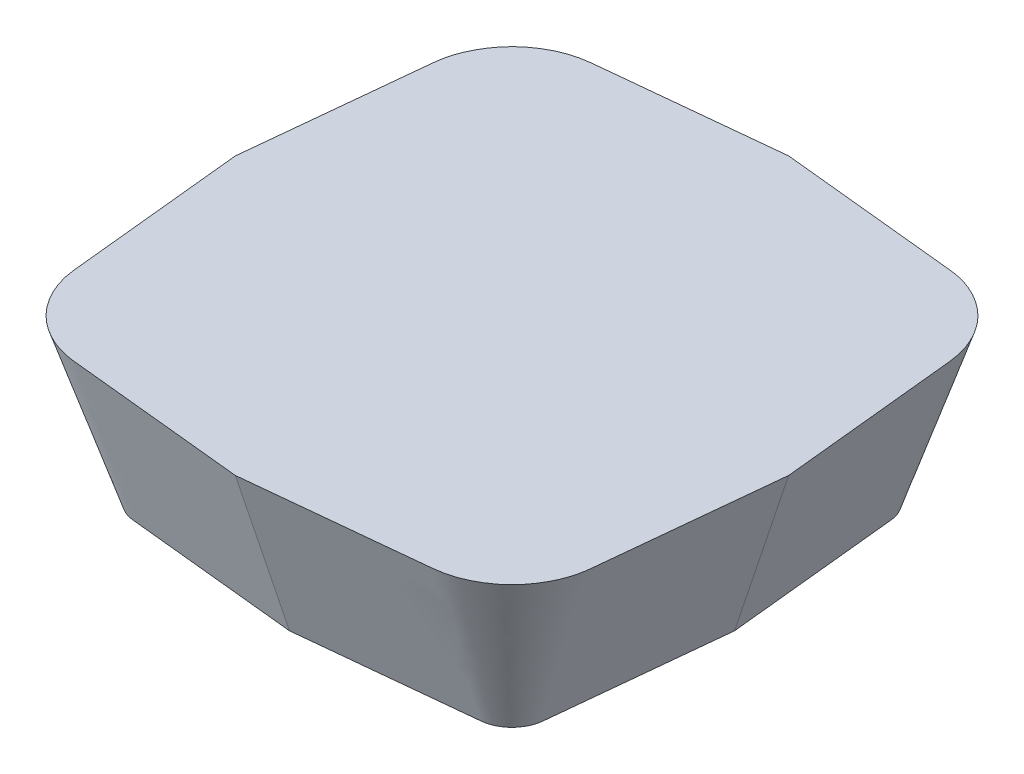
ISO-10303-21;
HEADER;
FILE_DESCRIPTION(('STEP AP214'),'2;1');
FILE_NAME('part.step','',(''),(''),'','','');
FILE_SCHEMA(('AUTOMOTIVE_DESIGN { 1 0 10303 214 1 1 1 1 }'));
ENDSEC;
DATA;
#1=APPLICATION_CONTEXT('core data for automotive mechanical design processes');
#2=APPLICATION_PROTOCOL_DEFINITION('international standard','automotive_design',2000,#1);
#3=PRODUCT_CONTEXT('',#1,'mechanical');
#4=PRODUCT('Part','Part','',(#3));
#5=PRODUCT_RELATED_PRODUCT_CATEGORY('part','',(#4));
#6=PRODUCT_DEFINITION_FORMATION('','',#4);
#7=PRODUCT_DEFINITION_CONTEXT('part definition',#1,'design');
#8=PRODUCT_DEFINITION('design','',#6,#7);
#9=PRODUCT_DEFINITION_SHAPE('','',#8);
#10=(LENGTH_UNIT() NAMED_UNIT(*) SI_UNIT(.MILLI.,.METRE.));
#11=(NAMED_UNIT(*) PLANE_ANGLE_UNIT() SI_UNIT($,.RADIAN.));
#12=(NAMED_UNIT(*) SI_UNIT($,.STERADIAN.) SOLID_ANGLE_UNIT());
#13=UNCERTAINTY_MEASURE_WITH_UNIT(LENGTH_MEASURE(1.E-05),#10,'distance_accuracy_value','');
#14=(GEOMETRIC_REPRESENTATION_CONTEXT(3) GLOBAL_UNCERTAINTY_ASSIGNED_CONTEXT((#13)) GLOBAL_UNIT_ASSIGNED_CONTEXT((#10,
#11,#12)) REPRESENTATION_CONTEXT('',''));
#15=CARTESIAN_POINT('',(0.,0.,0.));
#16=DIRECTION('',(0.,0.,1.));
#17=DIRECTION('',(1.,0.,0.));
#18=AXIS2_PLACEMENT_3D('',#15,#16,#17);
#19=CARTESIAN_POINT('',(-0.487303113514414,0.463919132742288,-0.487303113514415));
#20=DIRECTION('',(0.,1.,0.));
#21=DIRECTION('',(0.,0.,1.));
#22=AXIS2_PLACEMENT_3D('',#19,#20,#21);
#23=PLANE('',#22);
#24=CARTESIAN_POINT('',(0.739729912648628,0.463919132742288,-0.512936816014374));
#25=CARTESIAN_POINT('',(0.737452857510826,0.463919132742045,-0.535360019997695));
#26=CARTESIAN_POINT('',(0.726917252771635,0.463919132742045,-0.585643657845528));
#27=CARTESIAN_POINT('',(0.672247807856146,0.463919132742046,-0.671818827394402));
#28=CARTESIAN_POINT('',(0.585381563870512,0.463919132742045,-0.727219866965819));
#29=CARTESIAN_POINT('',(0.535360019997696,0.463919132742045,-0.737452857510825));
#30=CARTESIAN_POINT('',(0.512936816008313,0.463919132742288,-0.739729912649242));
#31=B_SPLINE_CURVE_WITH_KNOTS('',3,(#24,#25,#26,#27,#28,#29,#30),.UNSPECIFIED.,.F.,.F.,(4,1,1,1,
4),(0.,8.63475877317307E-05,0.000172695175618102,0.000259042763504472,0.000345390351242716),.UNSPECIFIED.);
#32=CARTESIAN_POINT('',(0.739729912648628,0.463919132742288,-0.512936816014374));
#33=VERTEX_POINT('',#32);
#34=CARTESIAN_POINT('',(0.512936816008313,0.463919132742288,-0.739729912649242));
#35=VERTEX_POINT('',#34);
#36=EDGE_CURVE('E11',#33,#35,#31,.T.);
#37=ORIENTED_EDGE('',*,*,#36,.T.);
#38=DIRECTION('',(-0.994883433381918,0.,-0.101029470859782));
#39=VECTOR('',#38,1.);
#40=CARTESIAN_POINT('',(0.512936816008313,0.463919132742288,-0.739729912649242));
#41=LINE('',#40,#39);
#42=CARTESIAN_POINT('',(0.,0.463919132742288,-0.791818160746472));
#43=VERTEX_POINT('',#42);
#44=EDGE_CURVE('E26',#35,#43,#41,.T.);
#45=ORIENTED_EDGE('',*,*,#44,.T.);
#46=DIRECTION('',(-0.994883433381918,0.,0.101029470859782));
#47=VECTOR('',#46,1.);
#48=CARTESIAN_POINT('',(0.,0.463919132742288,-0.791818160746472));
#49=LINE('',#48,#47);
#50=CARTESIAN_POINT('',(-0.512936816014374,0.463919132742288,-0.739729912648627));
#51=VERTEX_POINT('',#50);
#52=EDGE_CURVE('E291',#43,#51,#49,.T.);
#53=ORIENTED_EDGE('',*,*,#52,.T.);
#54=CARTESIAN_POINT('',(-0.512936816014374,0.463919132742288,-0.739729912648627));
#55=CARTESIAN_POINT('',(-0.535360019997694,0.463919132742045,-0.737452857510824));
#56=CARTESIAN_POINT('',(-0.585643657845528,0.463919132742045,-0.726917252771634));
#57=CARTESIAN_POINT('',(-0.671818827394401,0.463919132742044,-0.672247807856145));
#58=CARTESIAN_POINT('',(-0.727219866965817,0.463919132742045,-0.585381563870511));
#59=CARTESIAN_POINT('',(-0.737452857510823,0.463919132742045,-0.535360019997695));
#60=CARTESIAN_POINT('',(-0.739729912649243,0.463919132742288,-0.512936816008295));
#61=B_SPLINE_CURVE_WITH_KNOTS('',3,(#54,#55,#56,#57,#58,#59,#60),.UNSPECIFIED.,.F.,.F.,(4,1,1,1,
4),(0.,8.63475877317296E-05,0.0001726951756181,0.000259042763504469,0.000345390351242732),.UNSPECIFIED.);
#62=CARTESIAN_POINT('',(-0.739729912649243,0.463919132742288,-0.512936816008295));
#63=VERTEX_POINT('',#62);
#64=EDGE_CURVE('E286',#51,#63,#61,.T.);
#65=ORIENTED_EDGE('',*,*,#64,.T.);
#66=DIRECTION('',(-0.101029470859783,0.,0.994883433381918));
#67=VECTOR('',#66,1.);
#68=CARTESIAN_POINT('',(-0.739729912649243,0.463919132742288,-0.512936816008295));
#69=LINE('',#68,#67);
#70=CARTESIAN_POINT('',(-0.791818160746471,0.463919132742288,0.));
#71=VERTEX_POINT('',#70);
#72=EDGE_CURVE('E283',#63,#71,#69,.T.);
#73=ORIENTED_EDGE('',*,*,#72,.T.);
#74=DIRECTION('',(0.101029470859782,0.,0.994883433381918));
#75=VECTOR('',#74,1.);
#76=CARTESIAN_POINT('',(-0.791818160746471,0.463919132742288,0.));
#77=LINE('',#76,#75);
#78=CARTESIAN_POINT('',(-0.739729912648625,0.463919132742288,0.512936816014375));
#79=VERTEX_POINT('',#78);
#80=EDGE_CURVE('E277',#71,#79,#77,.T.);
#81=ORIENTED_EDGE('',*,*,#80,.T.);
#82=CARTESIAN_POINT('',(-0.739729912648625,0.463919132742288,0.512936816014375));
#83=CARTESIAN_POINT('',(-0.737452857510823,0.463919132742045,0.535360019997696));
#84=CARTESIAN_POINT('',(-0.726917252771632,0.463919132742045,0.585643657845529));
#85=CARTESIAN_POINT('',(-0.672247807856144,0.463919132742045,0.671818827394402));
#86=CARTESIAN_POINT('',(-0.585381563870509,0.463919132742045,0.727219866965819));
#87=CARTESIAN_POINT('',(-0.535360019997694,0.463919132742045,0.737452857510825));
#88=CARTESIAN_POINT('',(-0.512936816008294,0.463919132742288,0.739729912649244));
#89=B_SPLINE_CURVE_WITH_KNOTS('',3,(#82,#83,#84,#85,#86,#87,#88),.UNSPECIFIED.,.F.,.F.,(4,1,1,1,
4),(0.,8.63475877317294E-05,0.000172695175618099,0.000259042763504469,0.000345390351242732),.UNSPECIFIED.);
#90=CARTESIAN_POINT('',(-0.512936816008294,0.463919132742288,0.739729912649244));
#91=VERTEX_POINT('',#90);
#92=EDGE_CURVE('E272',#79,#91,#89,.T.);
#93=ORIENTED_EDGE('',*,*,#92,.T.);
#94=DIRECTION('',(0.994883433381918,0.,0.101029470859782));
#95=VECTOR('',#94,1.);
#96=CARTESIAN_POINT('',(-0.512936816008294,0.463919132742288,0.739729912649244));
#97=LINE('',#96,#95);
#98=CARTESIAN_POINT('',(0.,0.463919132742288,0.791818160746472));
#99=VERTEX_POINT('',#98);
#100=EDGE_CURVE('E269',#91,#99,#97,.T.);
#101=ORIENTED_EDGE('',*,*,#100,.T.);
#102=DIRECTION('',(0.994883433381918,0.,-0.101029470859782));
#103=VECTOR('',#102,1.);
#104=CARTESIAN_POINT('',(0.,0.463919132742288,0.791818160746472));
#105=LINE('',#104,#103);
#106=CARTESIAN_POINT('',(0.512936816014377,0.463919132742288,0.739729912648627));
#107=VERTEX_POINT('',#106);
#108=EDGE_CURVE('E263',#99,#107,#105,.T.);
#109=ORIENTED_EDGE('',*,*,#108,.T.);
#110=CARTESIAN_POINT('',(0.512936816014377,0.463919132742288,0.739729912648627));
#111=CARTESIAN_POINT('',(0.535360019997697,0.463919132742045,0.737452857510824));
#112=CARTESIAN_POINT('',(0.585643657845531,0.463919132742045,0.726917252771634));
#113=CARTESIAN_POINT('',(0.671818827394403,0.463919132742044,0.672247807856144));
#114=CARTESIAN_POINT('',(0.727219866965821,0.463919132742045,0.58538156387051));
#115=CARTESIAN_POINT('',(0.737452857510826,0.463919132742045,0.535360019997695));
#116=CARTESIAN_POINT('',(0.739729912649245,0.463919132742288,0.512936816008295));
#117=B_SPLINE_CURVE_WITH_KNOTS('',3,(#110,#111,#112,#113,#114,#115,#116),.UNSPECIFIED.,.F.,.F.,
(4,1,1,1,4),(0.,8.63475877317292E-05,0.000172695175618099,0.000259042763504469,
0.000345390351242732),.UNSPECIFIED.);
#118=CARTESIAN_POINT('',(0.739729912649245,0.463919132742288,0.512936816008295));
#119=VERTEX_POINT('',#118);
#120=EDGE_CURVE('E258',#107,#119,#117,.T.);
#121=ORIENTED_EDGE('',*,*,#120,.T.);
#122=DIRECTION('',(0.101029470859782,0.,-0.994883433381918));
#123=VECTOR('',#122,1.);
#124=CARTESIAN_POINT('',(0.739729912649245,0.463919132742288,0.512936816008295));
#125=LINE('',#124,#123);
#126=CARTESIAN_POINT('',(0.791818160746474,0.463919132742288,0.));
#127=VERTEX_POINT('',#126);
#128=EDGE_CURVE('E255',#119,#127,#125,.T.);
#129=ORIENTED_EDGE('',*,*,#128,.T.);
#130=DIRECTION('',(-0.101029470859782,0.,-0.994883433381918));
#131=VECTOR('',#130,1.);
#132=CARTESIAN_POINT('',(0.791818160746474,0.463919132742288,0.));
#133=LINE('',#132,#131);
#134=EDGE_CURVE('E252',#127,#33,#133,.T.);
#135=ORIENTED_EDGE('',*,*,#134,.T.);
#136=EDGE_LOOP('',(#37,#45,#53,#65,#73,#81,#93,#101,#109,#121,#129,#135));
#137=FACE_BOUND('',#136,.T.);
#138=ADVANCED_FACE('F16',(#137),#23,.T.);
#139=CARTESIAN_POINT('',(0.636800000000001,0.00124404717228733,0.));
#140=CARTESIAN_POINT('',(0.791818160746474,0.463919132742288,0.));
#141=CARTESIAN_POINT('',(0.632591167927994,0.00124404717228733,-0.041446295488747));
#142=CARTESIAN_POINT('',(0.787477473405038,0.463919132742288,-0.0427447346673593));
#143=CARTESIAN_POINT('',(0.623857478383657,0.00124404717228733,-0.12745093320501));
#144=CARTESIAN_POINT('',(0.779067398047436,0.463919132742288,-0.125562595392215));
#145=CARTESIAN_POINT('',(0.610500162679482,0.00124404717228733,-0.258986533613944));
#146=CARTESIAN_POINT('',(0.766647895277123,0.463919132742288,-0.247863122672757));
#147=CARTESIAN_POINT('',(0.59773609064706,0.00124404717228733,-0.384680192102684));
#148=CARTESIAN_POINT('',(0.7538851454418,0.463919132742288,-0.37354376088161));
#149=CARTESIAN_POINT('',(0.58997041732941,0.00124404717228733,-0.461152331044295));
#150=CARTESIAN_POINT('',(0.744716624420296,0.463919132742288,-0.463830383144223));
#151=CARTESIAN_POINT('',(0.584615279550299,0.00124404717228733,-0.513886823411481));
#152=CARTESIAN_POINT('',(0.737452857510906,0.463919132742288,-0.535360019997706));
#153=CARTESIAN_POINT('',(0.57612912271598,0.00124404717228733,-0.534294510842398));
#154=CARTESIAN_POINT('',(0.726917252771714,0.463919132742287,-0.585643657845555));
#155=CARTESIAN_POINT('',(0.559017354458549,0.00124404717228733,-0.559017354458548));
#156=CARTESIAN_POINT('',(0.672247807856206,0.463919132742288,-0.671818827394461));
#157=CARTESIAN_POINT('',(0.5342945108424,0.00124404717228733,-0.576129122715978));
#158=CARTESIAN_POINT('',(0.585381563870539,0.463919132742287,-0.727219866965898));
#159=CARTESIAN_POINT('',(0.513886823411482,0.00124404717228733,-0.584615279550297));
#160=CARTESIAN_POINT('',(0.535360019997708,0.463919132742288,-0.737452857510905));
#161=CARTESIAN_POINT('',(0.461152331044296,0.00124404717228733,-0.589970417329409));
#162=CARTESIAN_POINT('',(0.463830383144225,0.463919132742288,-0.744716624420294));
#163=CARTESIAN_POINT('',(0.384680192102685,0.00124404717228733,-0.597736090647059));
#164=CARTESIAN_POINT('',(0.373543760881611,0.463919132742288,-0.753885145441799));
#165=CARTESIAN_POINT('',(0.258986533613945,0.00124404717228733,-0.61050016267948));
#166=CARTESIAN_POINT('',(0.247863122672759,0.463919132742288,-0.766647895277121));
#167=CARTESIAN_POINT('',(0.127450933205011,0.00124404717228733,-0.623857478383656));
#168=CARTESIAN_POINT('',(0.125562595392216,0.463919132742287,-0.779067398047435));
#169=CARTESIAN_POINT('',(0.041446295488748,0.00124404717228733,-0.632591167927993));
#170=CARTESIAN_POINT('',(0.0427447346673604,0.463919132742288,-0.787477473405036));
#171=CARTESIAN_POINT('',(0.,0.00124404717228733,-0.6368));
#172=CARTESIAN_POINT('',(0.,0.463919132742288,-0.791818160746472));
#173=B_SPLINE_SURFACE_WITH_KNOTS('',3,1,((#139,#140),(#141,#142),(#143,#144),(#145,#146),(#147,
#148),(#149,#150),(#151,#152),(#153,#154),(#155,#156),(#157,#158),(#159,#160),(#161,#162),(#163,
#164),(#165,#166),(#167,#168),(#169,#170),(#171,#172)),.UNSPECIFIED.,.F.,.F.,.F.,(4,1,1,1,2,1,1,
1,2,1,1,1,4),(2,2),(0.,0.101765651250633,0.203531302501267,0.3052969537519,0.407062605002534,
0.453531302501267,0.5,0.546468697498733,0.592937394997467,0.6947030462481,0.796468697498733,
0.898234348749367,1.),(0.,1.),.UNSPECIFIED.);
#174=DIRECTION('',(-0.317690272542061,-0.948194542661025,0.));
#175=VECTOR('',#174,1.);
#176=CARTESIAN_POINT('',(0.714309080373237,0.232581589957287,0.));
#177=LINE('',#176,#175);
#178=CARTESIAN_POINT('',(0.636800000000001,0.00124404717228734,0.));
#179=VERTEX_POINT('',#178);
#180=EDGE_CURVE('E246',#127,#179,#177,.T.);
#181=CARTESIAN_POINT('',(0.636800000000001,0.00124404717228734,0.));
#182=CARTESIAN_POINT('',(0.632591167927994,0.00124404717228733,-0.041446295488747));
#183=CARTESIAN_POINT('',(0.623857478383657,0.00124404717228733,-0.12745093320501));
#184=CARTESIAN_POINT('',(0.610500162679482,0.00124404717228733,-0.258986533613944));
#185=CARTESIAN_POINT('',(0.59773609064706,0.00124404717228733,-0.384680192102684));
#186=CARTESIAN_POINT('',(0.58997041732941,0.00124404717228733,-0.461152331044295));
#187=CARTESIAN_POINT('',(0.586294015136042,0.00124404717228733,-0.497355545863736));
#188=B_SPLINE_CURVE_WITH_KNOTS('',3,(#181,#182,#183,#184,#185,#186,#187),.UNSPECIFIED.,.F.,.F.,
(4,1,1,1,4),(0.,0.101765651250633,0.203531302501267,0.3052969537519,0.407062605078399),.UNSPECIFIED.);
#189=CARTESIAN_POINT('',(0.586294015136042,0.00124404717228733,-0.497355545863736));
#190=VERTEX_POINT('',#189);
#191=EDGE_CURVE('E238',#179,#190,#188,.T.);
#192=CARTESIAN_POINT('',(0.586294015136042,0.00124404717228733,-0.497355545863736));
#193=CARTESIAN_POINT('',(0.584615279550299,0.00124404717228743,-0.513886823411481));
#194=CARTESIAN_POINT('',(0.57612912271598,0.00124404717228743,-0.534294510842398));
#195=CARTESIAN_POINT('',(0.559017354458549,0.00124404717228743,-0.559017354458548));
#196=CARTESIAN_POINT('',(0.5342945108424,0.00124404717228743,-0.576129122715978));
#197=CARTESIAN_POINT('',(0.513886823411482,0.00124404717228743,-0.584615279550297));
#198=CARTESIAN_POINT('',(0.497355545863124,0.00124404717228733,-0.586294015136103));
#199=B_SPLINE_CURVE_WITH_KNOTS('',3,(#192,#193,#194,#195,#196,#197,#198),.UNSPECIFIED.,.F.,.F.,
(4,1,1,1,4),(0.,3.37572425701318E-05,6.75144851953761E-05,0.000101271727820621,
0.000135028970399394),.UNSPECIFIED.);
#200=CARTESIAN_POINT('',(0.497355545863124,0.00124404717228733,-0.586294015136103));
#201=VERTEX_POINT('',#200);
#202=EDGE_CURVE('E230',#190,#201,#199,.T.);
#203=CARTESIAN_POINT('',(0.497355545863124,0.00124404717228733,-0.586294015136103));
#204=CARTESIAN_POINT('',(0.461152331044296,0.00124404717228733,-0.589970417329409));
#205=CARTESIAN_POINT('',(0.384680192102685,0.00124404717228733,-0.597736090647059));
#206=CARTESIAN_POINT('',(0.258986533613945,0.00124404717228733,-0.61050016267948));
#207=CARTESIAN_POINT('',(0.127450933205011,0.00124404717228733,-0.623857478383656));
#208=CARTESIAN_POINT('',(0.041446295488748,0.00124404717228733,-0.632591167927993));
#209=CARTESIAN_POINT('',(0.,0.00124404717228734,-0.6368));
#210=B_SPLINE_CURVE_WITH_KNOTS('',3,(#203,#204,#205,#206,#207,#208,#209),.UNSPECIFIED.,.F.,.F.,
(4,1,1,1,4),(0.592937394922176,0.6947030462481,0.796468697498733,0.898234348749367,1.),.UNSPECIFIED.);
#211=CARTESIAN_POINT('',(0.,0.00124404717228734,-0.6368));
#212=VERTEX_POINT('',#211);
#213=EDGE_CURVE('E225',#201,#212,#210,.T.);
#214=DIRECTION('',(0.,0.948194542661025,-0.317690272542061));
#215=VECTOR('',#214,1.);
#216=CARTESIAN_POINT('',(0.,0.232581589957287,-0.714309080373236));
#217=LINE('',#216,#215);
#218=EDGE_CURVE('E221',#212,#43,#217,.T.);
#219=ORIENTED_EDGE('',*,*,#134,.F.);
#220=ORIENTED_EDGE('',*,*,#180,.T.);
#221=ORIENTED_EDGE('',*,*,#191,.T.);
#222=ORIENTED_EDGE('',*,*,#202,.T.);
#223=ORIENTED_EDGE('',*,*,#213,.T.);
#224=ORIENTED_EDGE('',*,*,#218,.T.);
#225=ORIENTED_EDGE('',*,*,#44,.F.);
#226=ORIENTED_EDGE('',*,*,#36,.F.);
#227=EDGE_LOOP('',(#219,#220,#221,#222,#223,#224,#225,#226));
#228=FACE_BOUND('',#227,.T.);
#229=ADVANCED_FACE('F299',(#228),#173,.T.);
#230=CARTESIAN_POINT('',(0.,0.00124404717228733,0.6368));
#231=CARTESIAN_POINT('',(0.,0.463919132742288,0.791818160746472));
#232=CARTESIAN_POINT('',(0.0414462954887481,0.00124404717228733,0.632591167927993));
#233=CARTESIAN_POINT('',(0.0427447346673604,0.463919132742288,0.787477473405036));
#234=CARTESIAN_POINT('',(0.127450933205012,0.00124404717228733,0.623857478383657));
#235=CARTESIAN_POINT('',(0.125562595392216,0.463919132742288,0.779067398047435));
#236=CARTESIAN_POINT('',(0.258986533613945,0.00124404717228733,0.610500162679479));
#237=CARTESIAN_POINT('',(0.247863122672759,0.463919132742287,0.766647895277121));
#238=CARTESIAN_POINT('',(0.384680192102686,0.00124404717228733,0.59773609064706));
#239=CARTESIAN_POINT('',(0.373543760881612,0.463919132742288,0.7538851454418));
#240=CARTESIAN_POINT('',(0.461152331044296,0.00124404717228733,0.589970417329409));
#241=CARTESIAN_POINT('',(0.463830383144225,0.463919132742288,0.744716624420294));
#242=CARTESIAN_POINT('',(0.513886823411482,0.00124404717228733,0.584615279550297));
#243=CARTESIAN_POINT('',(0.535360019997708,0.463919132742288,0.737452857510905));
#244=CARTESIAN_POINT('',(0.534294510842399,0.00124404717228733,0.576129122715978));
#245=CARTESIAN_POINT('',(0.585643657845558,0.463919132742288,0.726917252771712));
#246=CARTESIAN_POINT('',(0.559017354458549,0.00124404717228733,0.559017354458547));
#247=CARTESIAN_POINT('',(0.671818827394462,0.463919132742287,0.672247807856204));
#248=CARTESIAN_POINT('',(0.576129122715979,0.00124404717228733,0.534294510842399));
#249=CARTESIAN_POINT('',(0.7272198669659,0.463919132742288,0.585381563870537));
#250=CARTESIAN_POINT('',(0.584615279550299,0.00124404717228733,0.513886823411481));
#251=CARTESIAN_POINT('',(0.737452857510906,0.463919132742288,0.535360019997706));
#252=CARTESIAN_POINT('',(0.58997041732941,0.00124404717228733,0.461152331044295));
#253=CARTESIAN_POINT('',(0.744716624420296,0.463919132742288,0.463830383144223));
#254=CARTESIAN_POINT('',(0.59773609064706,0.00124404717228733,0.384680192102684));
#255=CARTESIAN_POINT('',(0.7538851454418,0.463919132742287,0.37354376088161));
#256=CARTESIAN_POINT('',(0.610500162679481,0.00124404717228733,0.258986533613943));
#257=CARTESIAN_POINT('',(0.766647895277123,0.463919132742288,0.247863122672757));
#258=CARTESIAN_POINT('',(0.623857478383657,0.00124404717228733,0.12745093320501));
#259=CARTESIAN_POINT('',(0.779067398047436,0.463919132742287,0.125562595392215));
#260=CARTESIAN_POINT('',(0.632591167927994,0.00124404717228733,0.0414462954887468));
#261=CARTESIAN_POINT('',(0.787477473405038,0.463919132742288,0.0427447346673593));
#262=CARTESIAN_POINT('',(0.636800000000001,0.00124404717228733,0.));
#263=CARTESIAN_POINT('',(0.791818160746474,0.463919132742288,0.));
#264=B_SPLINE_SURFACE_WITH_KNOTS('',3,1,((#230,#231),(#232,#233),(#234,#235),(#236,#237),(#238,
#239),(#240,#241),(#242,#243),(#244,#245),(#246,#247),(#248,#249),(#250,#251),(#252,#253),(#254,
#255),(#256,#257),(#258,#259),(#260,#261),(#262,#263)),.UNSPECIFIED.,.F.,.F.,.F.,(4,1,1,1,2,1,1,
1,2,1,1,1,4),(2,2),(0.,0.101765651250633,0.203531302501267,0.3052969537519,0.407062605002534,
0.453531302501267,0.5,0.546468697498733,0.592937394997466,0.6947030462481,0.796468697498733,
0.898234348749367,1.),(0.,1.),.UNSPECIFIED.);
#265=DIRECTION('',(0.,-0.948194542661026,-0.31769027254206));
#266=VECTOR('',#265,1.);
#267=CARTESIAN_POINT('',(0.,0.232581589957287,0.714309080373236));
#268=LINE('',#267,#266);
#269=CARTESIAN_POINT('',(0.,0.00124404717228735,0.6368));
#270=VERTEX_POINT('',#269);
#271=EDGE_CURVE('E215',#99,#270,#268,.T.);
#272=CARTESIAN_POINT('',(0.,0.00124404717228735,0.6368));
#273=CARTESIAN_POINT('',(0.0414462954887481,0.00124404717228733,0.632591167927993));
#274=CARTESIAN_POINT('',(0.127450933205012,0.00124404717228733,0.623857478383657));
#275=CARTESIAN_POINT('',(0.258986533613945,0.00124404717228733,0.610500162679479));
#276=CARTESIAN_POINT('',(0.384680192102686,0.00124404717228733,0.59773609064706));
#277=CARTESIAN_POINT('',(0.461152331044296,0.00124404717228733,0.589970417329409));
#278=CARTESIAN_POINT('',(0.497355545863737,0.00124404717228733,0.586294015136041));
#279=B_SPLINE_CURVE_WITH_KNOTS('',3,(#272,#273,#274,#275,#276,#277,#278),.UNSPECIFIED.,.F.,.F.,
(4,1,1,1,4),(0.,0.101765651250633,0.203531302501267,0.3052969537519,0.4070626050784),.UNSPECIFIED.);
#280=CARTESIAN_POINT('',(0.497355545863737,0.00124404717228733,0.586294015136041));
#281=VERTEX_POINT('',#280);
#282=EDGE_CURVE('E207',#270,#281,#279,.T.);
#283=CARTESIAN_POINT('',(0.497355545863737,0.00124404717228733,0.586294015136041));
#284=CARTESIAN_POINT('',(0.513886823411482,0.00124404717228746,0.584615279550297));
#285=CARTESIAN_POINT('',(0.534294510842399,0.00124404717228746,0.576129122715979));
#286=CARTESIAN_POINT('',(0.559017354458549,0.00124404717228746,0.559017354458547));
#287=CARTESIAN_POINT('',(0.576129122715979,0.00124404717228746,0.534294510842399));
#288=CARTESIAN_POINT('',(0.584615279550299,0.00124404717228746,0.513886823411481));
#289=CARTESIAN_POINT('',(0.586294015136104,0.00124404717228733,0.497355545863122));
#290=B_SPLINE_CURVE_WITH_KNOTS('',3,(#283,#284,#285,#286,#287,#288,#289),.UNSPECIFIED.,.F.,.F.,
(4,1,1,1,4),(0.,3.37572425701321E-05,6.75144851953767E-05,0.000101271727820621,
0.000135028970399395),.UNSPECIFIED.);
#291=CARTESIAN_POINT('',(0.586294015136104,0.00124404717228733,0.497355545863122));
#292=VERTEX_POINT('',#291);
#293=EDGE_CURVE('E199',#281,#292,#290,.T.);
#294=CARTESIAN_POINT('',(0.586294015136104,0.00124404717228733,0.497355545863122));
#295=CARTESIAN_POINT('',(0.58997041732941,0.00124404717228733,0.461152331044295));
#296=CARTESIAN_POINT('',(0.59773609064706,0.00124404717228733,0.384680192102684));
#297=CARTESIAN_POINT('',(0.610500162679481,0.00124404717228733,0.258986533613943));
#298=CARTESIAN_POINT('',(0.623857478383657,0.00124404717228733,0.12745093320501));
#299=CARTESIAN_POINT('',(0.632591167927994,0.00124404717228733,0.0414462954887468));
#300=CARTESIAN_POINT('',(0.636800000000001,0.00124404717228734,0.));
#301=B_SPLINE_CURVE_WITH_KNOTS('',3,(#294,#295,#296,#297,#298,#299,#300),.UNSPECIFIED.,.F.,.F.,
(4,1,1,1,4),(0.592937394922176,0.6947030462481,0.796468697498733,0.898234348749367,1.),.UNSPECIFIED.);
#302=EDGE_CURVE('E193',#292,#179,#301,.T.);
#303=ORIENTED_EDGE('',*,*,#108,.F.);
#304=ORIENTED_EDGE('',*,*,#271,.T.);
#305=ORIENTED_EDGE('',*,*,#282,.T.);
#306=ORIENTED_EDGE('',*,*,#293,.T.);
#307=ORIENTED_EDGE('',*,*,#302,.T.);
#308=ORIENTED_EDGE('',*,*,#180,.F.);
#309=ORIENTED_EDGE('',*,*,#128,.F.);
#310=ORIENTED_EDGE('',*,*,#120,.F.);
#311=EDGE_LOOP('',(#303,#304,#305,#306,#307,#308,#309,#310));
#312=FACE_BOUND('',#311,.T.);
#313=ADVANCED_FACE('F307',(#312),#264,.T.);
#314=CARTESIAN_POINT('',(-0.636799999999999,0.00124404717228733,0.));
#315=CARTESIAN_POINT('',(-0.791818160746471,0.463919132742288,0.));
#316=CARTESIAN_POINT('',(-0.632591167927992,0.00124404717228733,0.0414462954887469));
#317=CARTESIAN_POINT('',(-0.787477473405035,0.463919132742288,0.0427447346673592));
#318=CARTESIAN_POINT('',(-0.623857478383656,0.00124404717228733,0.12745093320501));
#319=CARTESIAN_POINT('',(-0.779067398047432,0.463919132742287,0.125562595392215));
#320=CARTESIAN_POINT('',(-0.610500162679477,0.00124404717228733,0.258986533613943));
#321=CARTESIAN_POINT('',(-0.766647895277122,0.463919132742288,0.247863122672758));
#322=CARTESIAN_POINT('',(-0.597736090647059,0.00124404717228733,0.384680192102685));
#323=CARTESIAN_POINT('',(-0.753885145441797,0.463919132742288,0.37354376088161));
#324=CARTESIAN_POINT('',(-0.589970417329408,0.00124404717228733,0.461152331044295));
#325=CARTESIAN_POINT('',(-0.744716624420293,0.463919132742288,0.463830383144224));
#326=CARTESIAN_POINT('',(-0.584615279550296,0.00124404717228733,0.513886823411481));
#327=CARTESIAN_POINT('',(-0.737452857510904,0.463919132742288,0.535360019997707));
#328=CARTESIAN_POINT('',(-0.576129122715977,0.00124404717228733,0.534294510842398));
#329=CARTESIAN_POINT('',(-0.726917252771711,0.463919132742288,0.585643657845556));
#330=CARTESIAN_POINT('',(-0.559017354458547,0.00124404717228733,0.559017354458549));
#331=CARTESIAN_POINT('',(-0.672247807856203,0.463919132742288,0.671818827394461));
#332=CARTESIAN_POINT('',(-0.534294510842397,0.00124404717228733,0.576129122715977));
#333=CARTESIAN_POINT('',(-0.585381563870536,0.463919132742287,0.727219866965898));
#334=CARTESIAN_POINT('',(-0.51388682341148,0.00124404717228733,0.584615279550297));
#335=CARTESIAN_POINT('',(-0.535360019997705,0.463919132742288,0.737452857510905));
#336=CARTESIAN_POINT('',(-0.461152331044294,0.00124404717228733,0.589970417329409));
#337=CARTESIAN_POINT('',(-0.463830383144222,0.463919132742288,0.744716624420294));
#338=CARTESIAN_POINT('',(-0.384680192102683,0.00124404717228733,0.59773609064706));
#339=CARTESIAN_POINT('',(-0.373543760881609,0.463919132742288,0.7538851454418));
#340=CARTESIAN_POINT('',(-0.258986533613942,0.00124404717228733,0.610500162679479));
#341=CARTESIAN_POINT('',(-0.247863122672756,0.463919132742288,0.76664789527712));
#342=CARTESIAN_POINT('',(-0.127450933205009,0.00124404717228733,0.623857478383657));
#343=CARTESIAN_POINT('',(-0.125562595392214,0.463919132742287,0.779067398047436));
#344=CARTESIAN_POINT('',(-0.0414462954887458,0.00124404717228733,0.632591167927993));
#345=CARTESIAN_POINT('',(-0.0427447346673584,0.463919132742288,0.787477473405036));
#346=CARTESIAN_POINT('',(0.,0.00124404717228733,0.6368));
#347=CARTESIAN_POINT('',(0.,0.463919132742288,0.791818160746472));
#348=B_SPLINE_SURFACE_WITH_KNOTS('',3,1,((#314,#315),(#316,#317),(#318,#319),(#320,#321),(#322,
#323),(#324,#325),(#326,#327),(#328,#329),(#330,#331),(#332,#333),(#334,#335),(#336,#337),(#338,
#339),(#340,#341),(#342,#343),(#344,#345),(#346,#347)),.UNSPECIFIED.,.F.,.F.,.F.,(4,1,1,1,2,1,1,
1,2,1,1,1,4),(2,2),(0.,0.101765651250633,0.203531302501267,0.305296953751901,0.407062605002534,
0.453531302501267,0.5,0.546468697498733,0.592937394997466,0.6947030462481,0.796468697498733,
0.898234348749366,1.),(0.,1.),.UNSPECIFIED.);
#349=DIRECTION('',(0.31769027254206,-0.948194542661026,0.));
#350=VECTOR('',#349,1.);
#351=CARTESIAN_POINT('',(-0.714309080373235,0.232581589957287,0.));
#352=LINE('',#351,#350);
#353=CARTESIAN_POINT('',(-0.636799999999999,0.00124404717228735,0.));
#354=VERTEX_POINT('',#353);
#355=EDGE_CURVE('E187',#71,#354,#352,.T.);
#356=CARTESIAN_POINT('',(-0.636799999999999,0.00124404717228735,0.));
#357=CARTESIAN_POINT('',(-0.632591167927992,0.00124404717228733,0.0414462954887469));
#358=CARTESIAN_POINT('',(-0.623857478383656,0.00124404717228733,0.12745093320501));
#359=CARTESIAN_POINT('',(-0.610500162679477,0.00124404717228733,0.258986533613943));
#360=CARTESIAN_POINT('',(-0.597736090647059,0.00124404717228733,0.384680192102685));
#361=CARTESIAN_POINT('',(-0.589970417329408,0.00124404717228733,0.461152331044295));
#362=CARTESIAN_POINT('',(-0.58629401513604,0.00124404717228733,0.497355545863736));
#363=B_SPLINE_CURVE_WITH_KNOTS('',3,(#356,#357,#358,#359,#360,#361,#362),.UNSPECIFIED.,.F.,.F.,
(4,1,1,1,4),(0.,0.101765651250633,0.203531302501267,0.305296953751901,0.4070626050784),.UNSPECIFIED.);
#364=CARTESIAN_POINT('',(-0.58629401513604,0.00124404717228733,0.497355545863736));
#365=VERTEX_POINT('',#364);
#366=EDGE_CURVE('E144',#354,#365,#363,.T.);
#367=CARTESIAN_POINT('',(-0.58629401513604,0.00124404717228733,0.497355545863736));
#368=CARTESIAN_POINT('',(-0.584615279550296,0.00124404717228736,0.513886823411481));
#369=CARTESIAN_POINT('',(-0.576129122715977,0.00124404717228736,0.534294510842398));
#370=CARTESIAN_POINT('',(-0.559017354458547,0.00124404717228736,0.559017354458548));
#371=CARTESIAN_POINT('',(-0.534294510842397,0.00124404717228736,0.576129122715977));
#372=CARTESIAN_POINT('',(-0.51388682341148,0.00124404717228736,0.584615279550297));
#373=CARTESIAN_POINT('',(-0.497355545863121,0.00124404717228733,0.586294015136103));
#374=B_SPLINE_CURVE_WITH_KNOTS('',3,(#367,#368,#369,#370,#371,#372,#373),.UNSPECIFIED.,.F.,.F.,
(4,1,1,1,4),(0.,3.37572425701318E-05,6.75144851953763E-05,0.000101271727820621,
0.000135028970399395),.UNSPECIFIED.);
#375=CARTESIAN_POINT('',(-0.497355545863121,0.00124404717228733,0.586294015136103));
#376=VERTEX_POINT('',#375);
#377=EDGE_CURVE('E172',#365,#376,#374,.T.);
#378=CARTESIAN_POINT('',(-0.497355545863121,0.00124404717228733,0.586294015136103));
#379=CARTESIAN_POINT('',(-0.461152331044294,0.00124404717228733,0.589970417329409));
#380=CARTESIAN_POINT('',(-0.384680192102683,0.00124404717228733,0.59773609064706));
#381=CARTESIAN_POINT('',(-0.258986533613942,0.00124404717228733,0.610500162679479));
#382=CARTESIAN_POINT('',(-0.127450933205009,0.00124404717228733,0.623857478383657));
#383=CARTESIAN_POINT('',(-0.0414462954887458,0.00124404717228733,0.632591167927993));
#384=CARTESIAN_POINT('',(0.,0.00124404717228735,0.6368));
#385=B_SPLINE_CURVE_WITH_KNOTS('',3,(#378,#379,#380,#381,#382,#383,#384),.UNSPECIFIED.,.F.,.F.,
(4,1,1,1,4),(0.592937394922176,0.6947030462481,0.796468697498733,0.898234348749366,1.),.UNSPECIFIED.);
#386=EDGE_CURVE('E163',#376,#270,#385,.T.);
#387=ORIENTED_EDGE('',*,*,#80,.F.);
#388=ORIENTED_EDGE('',*,*,#355,.T.);
#389=ORIENTED_EDGE('',*,*,#366,.T.);
#390=ORIENTED_EDGE('',*,*,#377,.T.);
#391=ORIENTED_EDGE('',*,*,#386,.T.);
#392=ORIENTED_EDGE('',*,*,#271,.F.);
#393=ORIENTED_EDGE('',*,*,#100,.F.);
#394=ORIENTED_EDGE('',*,*,#92,.F.);
#395=EDGE_LOOP('',(#387,#388,#389,#390,#391,#392,#393,#394));
#396=FACE_BOUND('',#395,.T.);
#397=ADVANCED_FACE('F314',(#396),#348,.T.);
#398=CARTESIAN_POINT('',(0.,0.00124404717228733,-0.6368));
#399=CARTESIAN_POINT('',(0.,0.463919132742288,-0.791818160746472));
#400=CARTESIAN_POINT('',(-0.0414462954887458,0.00124404717228733,-0.632591167927993));
#401=CARTESIAN_POINT('',(-0.0427447346673583,0.463919132742288,-0.787477473405036));
#402=CARTESIAN_POINT('',(-0.127450933205009,0.00124404717228733,-0.623857478383657));
#403=CARTESIAN_POINT('',(-0.125562595392214,0.463919132742288,-0.779067398047434));
#404=CARTESIAN_POINT('',(-0.258986533613942,0.00124404717228733,-0.610500162679479));
#405=CARTESIAN_POINT('',(-0.247863122672757,0.463919132742287,-0.766647895277122));
#406=CARTESIAN_POINT('',(-0.384680192102683,0.00124404717228733,-0.59773609064706));
#407=CARTESIAN_POINT('',(-0.373543760881609,0.463919132742288,-0.753885145441798));
#408=CARTESIAN_POINT('',(-0.461152331044294,0.00124404717228733,-0.589970417329409));
#409=CARTESIAN_POINT('',(-0.463830383144223,0.463919132742288,-0.744716624420294));
#410=CARTESIAN_POINT('',(-0.51388682341148,0.00124404717228733,-0.584615279550297));
#411=CARTESIAN_POINT('',(-0.535360019997705,0.463919132742288,-0.737452857510905));
#412=CARTESIAN_POINT('',(-0.534294510842397,0.00124404717228733,-0.576129122715978));
#413=CARTESIAN_POINT('',(-0.585643657845555,0.463919132742288,-0.726917252771713));
#414=CARTESIAN_POINT('',(-0.559017354458546,0.00124404717228733,-0.559017354458547));
#415=CARTESIAN_POINT('',(-0.67181882739446,0.463919132742287,-0.672247807856204));
#416=CARTESIAN_POINT('',(-0.576129122715977,0.00124404717228733,-0.534294510842399));
#417=CARTESIAN_POINT('',(-0.727219866965897,0.463919132742288,-0.585381563870538));
#418=CARTESIAN_POINT('',(-0.584615279550296,0.00124404717228733,-0.513886823411481));
#419=CARTESIAN_POINT('',(-0.737452857510903,0.463919132742288,-0.535360019997706));
#420=CARTESIAN_POINT('',(-0.589970417329407,0.00124404717228733,-0.461152331044295));
#421=CARTESIAN_POINT('',(-0.744716624420293,0.463919132742288,-0.463830383144223));
#422=CARTESIAN_POINT('',(-0.597736090647058,0.00124404717228733,-0.384680192102684));
#423=CARTESIAN_POINT('',(-0.753885145441797,0.463919132742287,-0.37354376088161));
#424=CARTESIAN_POINT('',(-0.610500162679478,0.00124404717228733,-0.258986533613943));
#425=CARTESIAN_POINT('',(-0.76664789527712,0.463919132742288,-0.247863122672757));
#426=CARTESIAN_POINT('',(-0.623857478383655,0.00124404717228733,-0.127450933205011));
#427=CARTESIAN_POINT('',(-0.779067398047433,0.463919132742287,-0.125562595392216));
#428=CARTESIAN_POINT('',(-0.632591167927992,0.00124404717228733,-0.041446295488747));
#429=CARTESIAN_POINT('',(-0.787477473405035,0.463919132742288,-0.0427447346673596));
#430=CARTESIAN_POINT('',(-0.636799999999999,0.00124404717228733,0.));
#431=CARTESIAN_POINT('',(-0.791818160746471,0.463919132742288,0.));
#432=B_SPLINE_SURFACE_WITH_KNOTS('',3,1,((#398,#399),(#400,#401),(#402,#403),(#404,#405),(#406,
#407),(#408,#409),(#410,#411),(#412,#413),(#414,#415),(#416,#417),(#418,#419),(#420,#421),(#422,
#423),(#424,#425),(#426,#427),(#428,#429),(#430,#431)),.UNSPECIFIED.,.F.,.F.,.F.,(4,1,1,1,2,1,1,
1,2,1,1,1,4),(2,2),(0.,0.101765651250633,0.203531302501267,0.3052969537519,0.407062605002534,
0.453531302501267,0.5,0.546468697498733,0.592937394997466,0.6947030462481,0.796468697498733,
0.898234348749366,1.),(0.,1.),.UNSPECIFIED.);
#433=CARTESIAN_POINT('',(0.,0.00124404717228734,-0.6368));
#434=CARTESIAN_POINT('',(-0.0414462954887458,0.00124404717228733,-0.632591167927993));
#435=CARTESIAN_POINT('',(-0.127450933205009,0.00124404717228733,-0.623857478383657));
#436=CARTESIAN_POINT('',(-0.258986533613942,0.00124404717228733,-0.610500162679479));
#437=CARTESIAN_POINT('',(-0.384680192102683,0.00124404717228733,-0.59773609064706));
#438=CARTESIAN_POINT('',(-0.461152331044294,0.00124404717228733,-0.589970417329409));
#439=CARTESIAN_POINT('',(-0.497355545863734,0.00124404717228733,-0.586294015136041));
#440=B_SPLINE_CURVE_WITH_KNOTS('',3,(#433,#434,#435,#436,#437,#438,#439),.UNSPECIFIED.,.F.,.F.,
(4,1,1,1,4),(0.,0.101765651250633,0.203531302501267,0.3052969537519,0.407062605078399),.UNSPECIFIED.);
#441=CARTESIAN_POINT('',(-0.497355545863734,0.00124404717228733,-0.586294015136041));
#442=VERTEX_POINT('',#441);
#443=EDGE_CURVE('E136',#212,#442,#440,.T.);
#444=CARTESIAN_POINT('',(-0.497355545863734,0.00124404717228733,-0.586294015136041));
#445=CARTESIAN_POINT('',(-0.51388682341148,0.00124404717228735,-0.584615279550297));
#446=CARTESIAN_POINT('',(-0.534294510842397,0.00124404717228735,-0.576129122715978));
#447=CARTESIAN_POINT('',(-0.559017354458546,0.00124404717228735,-0.559017354458547));
#448=CARTESIAN_POINT('',(-0.576129122715977,0.00124404717228735,-0.534294510842399));
#449=CARTESIAN_POINT('',(-0.584615279550296,0.00124404717228735,-0.513886823411481));
#450=CARTESIAN_POINT('',(-0.586294015136101,0.00124404717228733,-0.497355545863123));
#451=B_SPLINE_CURVE_WITH_KNOTS('',3,(#444,#445,#446,#447,#448,#449,#450),.UNSPECIFIED.,.F.,.F.,
(4,1,1,1,4),(0.,3.37572425701319E-05,6.75144851953763E-05,0.000101271727820621,
0.000135028970399394),.UNSPECIFIED.);
#452=CARTESIAN_POINT('',(-0.586294015136101,0.00124404717228733,-0.497355545863123));
#453=VERTEX_POINT('',#452);
#454=EDGE_CURVE('E128',#442,#453,#451,.T.);
#455=CARTESIAN_POINT('',(-0.586294015136101,0.00124404717228733,-0.497355545863123));
#456=CARTESIAN_POINT('',(-0.589970417329407,0.00124404717228733,-0.461152331044295));
#457=CARTESIAN_POINT('',(-0.597736090647058,0.00124404717228733,-0.384680192102684));
#458=CARTESIAN_POINT('',(-0.610500162679478,0.00124404717228733,-0.258986533613943));
#459=CARTESIAN_POINT('',(-0.623857478383655,0.00124404717228733,-0.127450933205011));
#460=CARTESIAN_POINT('',(-0.632591167927992,0.00124404717228733,-0.041446295488747));
#461=CARTESIAN_POINT('',(-0.636799999999999,0.00124404717228735,0.));
#462=B_SPLINE_CURVE_WITH_KNOTS('',3,(#455,#456,#457,#458,#459,#460,#461),.UNSPECIFIED.,.F.,.F.,
(4,1,1,1,4),(0.592937394922175,0.6947030462481,0.796468697498733,0.898234348749366,1.),.UNSPECIFIED.);
#463=EDGE_CURVE('E133',#453,#354,#462,.T.);
#464=ORIENTED_EDGE('',*,*,#52,.F.);
#465=ORIENTED_EDGE('',*,*,#218,.F.);
#466=ORIENTED_EDGE('',*,*,#443,.T.);
#467=ORIENTED_EDGE('',*,*,#454,.T.);
#468=ORIENTED_EDGE('',*,*,#463,.T.);
#469=ORIENTED_EDGE('',*,*,#355,.F.);
#470=ORIENTED_EDGE('',*,*,#72,.F.);
#471=ORIENTED_EDGE('',*,*,#64,.F.);
#472=EDGE_LOOP('',(#464,#465,#466,#467,#468,#469,#470,#471));
#473=FACE_BOUND('',#472,.T.);
#474=ADVANCED_FACE('F131',(#473),#432,.T.);
#475=CARTESIAN_POINT('',(-0.487303113514414,0.00124404717228733,-0.487303113514415));
#476=DIRECTION('',(0.,1.,0.));
#477=DIRECTION('',(0.,0.,1.));
#478=AXIS2_PLACEMENT_3D('',#475,#476,#477);
#479=PLANE('',#478);
#480=ORIENTED_EDGE('',*,*,#202,.F.);
#481=ORIENTED_EDGE('',*,*,#191,.F.);
#482=ORIENTED_EDGE('',*,*,#302,.F.);
#483=ORIENTED_EDGE('',*,*,#293,.F.);
#484=ORIENTED_EDGE('',*,*,#282,.F.);
#485=ORIENTED_EDGE('',*,*,#386,.F.);
#486=ORIENTED_EDGE('',*,*,#377,.F.);
#487=ORIENTED_EDGE('',*,*,#366,.F.);
#488=ORIENTED_EDGE('',*,*,#463,.F.);
#489=ORIENTED_EDGE('',*,*,#454,.F.);
#490=ORIENTED_EDGE('',*,*,#443,.F.);
#491=ORIENTED_EDGE('',*,*,#213,.F.);
#492=EDGE_LOOP('',(#480,#481,#482,#483,#484,#485,#486,#487,#488,#489,#490,#491));
#493=FACE_BOUND('',#492,.T.);
#494=ADVANCED_FACE('F142',(#493),#479,.F.);
#495=CLOSED_SHELL('',(#138,#229,#313,#397,#474,#494));
#496=MANIFOLD_SOLID_BREP('B1',#495);
#497=ADVANCED_BREP_SHAPE_REPRESENTATION('',(#18,#496),#14);
#498=SHAPE_DEFINITION_REPRESENTATION(#9,#497);
ENDSEC;
END-ISO-10303-21;
